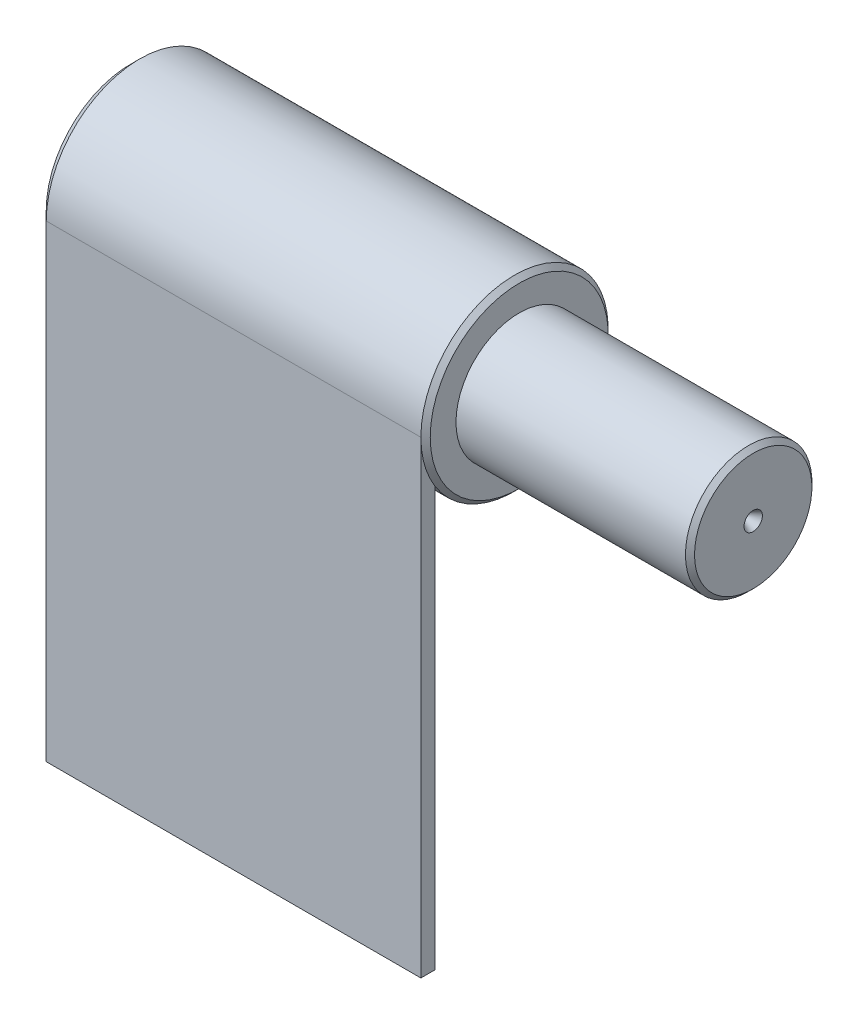
ISO-10303-21;
HEADER;
FILE_DESCRIPTION(('STEP AP214'),'2;1');
FILE_NAME('part.step','',(''),(''),'','','');
FILE_SCHEMA(('AUTOMOTIVE_DESIGN { 1 0 10303 214 1 1 1 1 }'));
ENDSEC;
DATA;
#1=APPLICATION_CONTEXT('core data for automotive mechanical design processes');
#2=APPLICATION_PROTOCOL_DEFINITION('international standard','automotive_design',2000,#1);
#3=PRODUCT_CONTEXT('',#1,'mechanical');
#4=PRODUCT('Part','Part','',(#3));
#5=PRODUCT_RELATED_PRODUCT_CATEGORY('part','',(#4));
#6=PRODUCT_DEFINITION_FORMATION('','',#4);
#7=PRODUCT_DEFINITION_CONTEXT('part definition',#1,'design');
#8=PRODUCT_DEFINITION('design','',#6,#7);
#9=PRODUCT_DEFINITION_SHAPE('','',#8);
#10=(LENGTH_UNIT() NAMED_UNIT(*) SI_UNIT(.MILLI.,.METRE.));
#11=(NAMED_UNIT(*) PLANE_ANGLE_UNIT() SI_UNIT($,.RADIAN.));
#12=(NAMED_UNIT(*) SI_UNIT($,.STERADIAN.) SOLID_ANGLE_UNIT());
#13=UNCERTAINTY_MEASURE_WITH_UNIT(LENGTH_MEASURE(1.E-05),#10,'distance_accuracy_value','');
#14=(GEOMETRIC_REPRESENTATION_CONTEXT(3) GLOBAL_UNCERTAINTY_ASSIGNED_CONTEXT((#13)) GLOBAL_UNIT_ASSIGNED_CONTEXT((#10,
#11,#12)) REPRESENTATION_CONTEXT('',''));
#15=CARTESIAN_POINT('',(0.,0.,0.));
#16=DIRECTION('',(0.,0.,1.));
#17=DIRECTION('',(1.,0.,0.));
#18=AXIS2_PLACEMENT_3D('',#15,#16,#17);
#19=CARTESIAN_POINT('',(-47.5274973026254,0.,-20.337527378994));
#20=DIRECTION('',(1.,0.,0.));
#21=DIRECTION('',(0.,0.,-1.));
#22=AXIS2_PLACEMENT_3D('',#19,#20,#21);
#23=PLANE('',#22);
#24=CARTESIAN_POINT('',(-47.5274973026254,0.,-2.337527378994));
#25=DIRECTION('',(-1.,0.,0.));
#26=DIRECTION('',(0.,0.,1.));
#27=AXIS2_PLACEMENT_3D('',#24,#25,#26);
#28=CIRCLE('',#27,18.);
#29=CARTESIAN_POINT('',(-47.5274973026254,0.,15.662472621006));
#30=VERTEX_POINT('',#29);
#31=EDGE_CURVE('E11',#30,#30,#28,.T.);
#32=ORIENTED_EDGE('',*,*,#31,.T.);
#33=EDGE_LOOP('',(#32));
#34=FACE_BOUND('',#33,.T.);
#35=ADVANCED_FACE('F35',(#34),#23,.F.);
#36=CARTESIAN_POINT('',(-45.5274973026254,0.,-2.337527378994));
#37=DIRECTION('',(1.,0.,0.));
#38=DIRECTION('',(0.,0.,-1.));
#39=AXIS2_PLACEMENT_3D('',#36,#37,#38);
#40=CONICAL_SURFACE('',#39,20.,0.78539816339745);
#41=ORIENTED_EDGE('',*,*,#31,.F.);
#42=EDGE_LOOP('',(#41));
#43=FACE_BOUND('',#42,.T.);
#44=CARTESIAN_POINT('',(-45.5274973026254,0.,-2.337527378994));
#45=DIRECTION('',(-1.,0.,0.));
#46=DIRECTION('',(0.,0.,1.));
#47=AXIS2_PLACEMENT_3D('',#44,#45,#46);
#48=CIRCLE('',#47,20.);
#49=CARTESIAN_POINT('',(-45.5274973026254,0.,17.662472621006));
#50=VERTEX_POINT('',#49);
#51=CARTESIAN_POINT('',(-45.5274973026254,-10.5357384574783,14.6624201255018));
#52=VERTEX_POINT('',#51);
#53=EDGE_CURVE('E42',#50,#52,#48,.T.);
#54=ORIENTED_EDGE('',*,*,#53,.T.);
#55=EDGE_CURVE('E55',#52,#50,#48,.T.);
#56=ORIENTED_EDGE('',*,*,#55,.T.);
#57=EDGE_LOOP('',(#54,#56));
#58=FACE_BOUND('',#57,.T.);
#59=ADVANCED_FACE('F133',(#43,#58),#40,.T.);
#60=CARTESIAN_POINT('',(-58.6080417490214,0.,-2.337527378994));
#61=DIRECTION('',(-1.,0.,0.));
#62=DIRECTION('',(0.,0.,1.));
#63=AXIS2_PLACEMENT_3D('',#60,#61,#62);
#64=CYLINDRICAL_SURFACE('',#63,20.);
#65=CARTESIAN_POINT('',(34.4725026973746,0.,-2.337527378994));
#66=DIRECTION('',(-1.,0.,0.));
#67=DIRECTION('',(0.,0.,1.));
#68=AXIS2_PLACEMENT_3D('',#65,#66,#67);
#69=CIRCLE('',#68,20.);
#70=CARTESIAN_POINT('',(34.4725026973746,0.,17.662472621006));
#71=VERTEX_POINT('',#70);
#72=CARTESIAN_POINT('',(34.4725026973746,-10.5357384574783,14.6624201255018));
#73=VERTEX_POINT('',#72);
#74=EDGE_CURVE('E132',#71,#73,#69,.T.);
#75=ORIENTED_EDGE('',*,*,#74,.T.);
#76=DIRECTION('',(-1.,0.,0.));
#77=VECTOR('',#76,1.);
#78=CARTESIAN_POINT('',(-58.6080417490214,-10.5357384574783,14.6624201255018));
#79=LINE('',#78,#77);
#80=EDGE_CURVE('E49',#73,#52,#79,.T.);
#81=ORIENTED_EDGE('',*,*,#80,.T.);
#82=ORIENTED_EDGE('',*,*,#53,.F.);
#83=DIRECTION('',(1.,0.,0.));
#84=VECTOR('',#83,1.);
#85=CARTESIAN_POINT('',(-45.5274973026254,0.,17.662472621006));
#86=LINE('',#85,#84);
#87=EDGE_CURVE('E86',#50,#71,#86,.T.);
#88=ORIENTED_EDGE('',*,*,#87,.T.);
#89=EDGE_LOOP('',(#75,#81,#82,#88));
#90=FACE_BOUND('',#89,.T.);
#91=ADVANCED_FACE('F142',(#90),#64,.T.);
#92=CARTESIAN_POINT('',(35.4725026973746,0.,-2.337527378994));
#93=DIRECTION('',(-1.,0.,0.));
#94=DIRECTION('',(0.,0.,1.));
#95=AXIS2_PLACEMENT_3D('',#92,#93,#94);
#96=CONICAL_SURFACE('',#95,19.,0.785398163397448);
#97=ORIENTED_EDGE('',*,*,#74,.F.);
#98=EDGE_CURVE('E131',#73,#71,#69,.T.);
#99=ORIENTED_EDGE('',*,*,#98,.F.);
#100=EDGE_LOOP('',(#97,#99));
#101=FACE_BOUND('',#100,.T.);
#102=CARTESIAN_POINT('',(35.4725026973746,0.,-2.337527378994));
#103=DIRECTION('',(-1.,0.,0.));
#104=DIRECTION('',(0.,0.,1.));
#105=AXIS2_PLACEMENT_3D('',#102,#103,#104);
#106=CIRCLE('',#105,19.);
#107=CARTESIAN_POINT('',(35.4725026973746,0.,16.662472621006));
#108=VERTEX_POINT('',#107);
#109=EDGE_CURVE('E128',#108,#108,#106,.T.);
#110=ORIENTED_EDGE('',*,*,#109,.T.);
#111=EDGE_LOOP('',(#110));
#112=FACE_BOUND('',#111,.T.);
#113=ADVANCED_FACE('F140',(#101,#112),#96,.T.);
#114=CARTESIAN_POINT('',(35.4725026973746,0.,-21.337527378994));
#115=DIRECTION('',(-1.,0.,0.));
#116=DIRECTION('',(0.,0.,1.));
#117=AXIS2_PLACEMENT_3D('',#114,#115,#116);
#118=PLANE('',#117);
#119=ORIENTED_EDGE('',*,*,#109,.F.);
#120=EDGE_LOOP('',(#119));
#121=FACE_BOUND('',#120,.T.);
#122=CARTESIAN_POINT('',(35.4725026973746,0.,-2.337527378994));
#123=DIRECTION('',(-1.,0.,0.));
#124=DIRECTION('',(0.,0.,1.));
#125=AXIS2_PLACEMENT_3D('',#122,#123,#124);
#126=CIRCLE('',#125,13.5);
#127=CARTESIAN_POINT('',(35.4725026973746,0.,11.162472621006));
#128=VERTEX_POINT('',#127);
#129=EDGE_CURVE('E125',#128,#128,#126,.T.);
#130=ORIENTED_EDGE('',*,*,#129,.T.);
#131=EDGE_LOOP('',(#130));
#132=FACE_BOUND('',#131,.T.);
#133=ADVANCED_FACE('F149',(#121,#132),#118,.F.);
#134=CARTESIAN_POINT('',(-58.6080417490214,0.,-2.337527378994));
#135=DIRECTION('',(-1.,0.,0.));
#136=DIRECTION('',(0.,0.,1.));
#137=AXIS2_PLACEMENT_3D('',#134,#135,#136);
#138=CYLINDRICAL_SURFACE('',#137,13.5);
#139=ORIENTED_EDGE('',*,*,#129,.F.);
#140=EDGE_LOOP('',(#139));
#141=FACE_BOUND('',#140,.T.);
#142=CARTESIAN_POINT('',(84.4725026973746,0.,-2.337527378994));
#143=DIRECTION('',(-1.,0.,0.));
#144=DIRECTION('',(0.,0.,1.));
#145=AXIS2_PLACEMENT_3D('',#142,#143,#144);
#146=CIRCLE('',#145,13.5);
#147=CARTESIAN_POINT('',(84.4725026973746,0.,11.162472621006));
#148=VERTEX_POINT('',#147);
#149=EDGE_CURVE('E122',#148,#148,#146,.T.);
#150=ORIENTED_EDGE('',*,*,#149,.T.);
#151=EDGE_LOOP('',(#150));
#152=FACE_BOUND('',#151,.T.);
#153=ADVANCED_FACE('F182',(#141,#152),#138,.T.);
#154=CARTESIAN_POINT('',(85.4415583764698,0.,-2.337527378994));
#155=DIRECTION('',(-1.,0.,0.));
#156=DIRECTION('',(0.,0.,1.));
#157=AXIS2_PLACEMENT_3D('',#154,#155,#156);
#158=CONICAL_SURFACE('',#157,12.5309443209048,0.785398163397463);
#159=ORIENTED_EDGE('',*,*,#149,.F.);
#160=EDGE_LOOP('',(#159));
#161=FACE_BOUND('',#160,.T.);
#162=CARTESIAN_POINT('',(85.4415583764698,0.,-2.337527378994));
#163=DIRECTION('',(-1.,0.,0.));
#164=DIRECTION('',(0.,0.,1.));
#165=AXIS2_PLACEMENT_3D('',#162,#163,#164);
#166=CIRCLE('',#165,12.5309443209048);
#167=CARTESIAN_POINT('',(85.4415583764698,0.,10.1934169419108));
#168=VERTEX_POINT('',#167);
#169=EDGE_CURVE('E119',#168,#168,#166,.T.);
#170=ORIENTED_EDGE('',*,*,#169,.T.);
#171=EDGE_LOOP('',(#170));
#172=FACE_BOUND('',#171,.T.);
#173=ADVANCED_FACE('F189',(#161,#172),#158,.T.);
#174=CARTESIAN_POINT('',(85.4415583764698,0.,-14.8684716998988));
#175=DIRECTION('',(-1.,0.,0.));
#176=DIRECTION('',(0.,0.,1.));
#177=AXIS2_PLACEMENT_3D('',#174,#175,#176);
#178=PLANE('',#177);
#179=ORIENTED_EDGE('',*,*,#169,.F.);
#180=EDGE_LOOP('',(#179));
#181=FACE_BOUND('',#180,.T.);
#182=CARTESIAN_POINT('',(85.4415583764698,0.,-2.337527378994));
#183=DIRECTION('',(-1.,0.,0.));
#184=DIRECTION('',(0.,0.,1.));
#185=AXIS2_PLACEMENT_3D('',#182,#183,#184);
#186=CIRCLE('',#185,1.95889593673989);
#187=CARTESIAN_POINT('',(85.4415583764698,0.,-0.378631442254107));
#188=VERTEX_POINT('',#187);
#189=EDGE_CURVE('E116',#188,#188,#186,.T.);
#190=ORIENTED_EDGE('',*,*,#189,.T.);
#191=EDGE_LOOP('',(#190));
#192=FACE_BOUND('',#191,.T.);
#193=ADVANCED_FACE('F197',(#181,#192),#178,.F.);
#194=CARTESIAN_POINT('',(82.259183131536,0.,-2.337527378994));
#195=DIRECTION('',(1.,0.,0.));
#196=DIRECTION('',(0.,0.,-1.));
#197=AXIS2_PLACEMENT_3D('',#194,#195,#196);
#198=CONICAL_SURFACE('',#197,0.,0.551771479369417);
#199=ORIENTED_EDGE('',*,*,#189,.F.);
#200=EDGE_LOOP('',(#199));
#201=FACE_BOUND('',#200,.T.);
#202=CARTESIAN_POINT('',(82.259183131536,0.,-2.337527378994));
#203=VERTEX_POINT('',#202);
#204=VERTEX_LOOP('',#203);
#205=FACE_BOUND('',#204,.T.);
#206=ADVANCED_FACE('F205',(#201,#205),#198,.F.);
#207=CARTESIAN_POINT('',(-45.5274973026254,-100.,17.662472621006));
#208=DIRECTION('',(-1.,0.,0.));
#209=DIRECTION('',(0.,0.,1.));
#210=AXIS2_PLACEMENT_3D('',#207,#208,#209);
#211=PLANE('',#210);
#212=ORIENTED_EDGE('',*,*,#55,.F.);
#213=DIRECTION('',(0.,1.,0.));
#214=VECTOR('',#213,1.);
#215=CARTESIAN_POINT('',(-45.5274973026254,-100.,14.6624201255018));
#216=LINE('',#215,#214);
#217=CARTESIAN_POINT('',(-45.5274973026254,-100.,14.6624201255018));
#218=VERTEX_POINT('',#217);
#219=EDGE_CURVE('E104',#218,#52,#216,.T.);
#220=ORIENTED_EDGE('',*,*,#219,.F.);
#221=DIRECTION('',(0.,0.,1.));
#222=VECTOR('',#221,1.);
#223=CARTESIAN_POINT('',(-45.5274973026254,-100.,17.662472621006));
#224=LINE('',#223,#222);
#225=CARTESIAN_POINT('',(-45.5274973026254,-100.,17.662472621006));
#226=VERTEX_POINT('',#225);
#227=EDGE_CURVE('E97',#218,#226,#224,.T.);
#228=ORIENTED_EDGE('',*,*,#227,.T.);
#229=DIRECTION('',(0.,1.,0.));
#230=VECTOR('',#229,1.);
#231=CARTESIAN_POINT('',(-45.5274973026254,-100.,17.662472621006));
#232=LINE('',#231,#230);
#233=EDGE_CURVE('E80',#226,#50,#232,.T.);
#234=ORIENTED_EDGE('',*,*,#233,.T.);
#235=EDGE_LOOP('',(#212,#220,#228,#234));
#236=FACE_BOUND('',#235,.T.);
#237=ADVANCED_FACE('F102',(#236),#211,.T.);
#238=CARTESIAN_POINT('',(-45.5274973026254,-100.,14.6624201255018));
#239=DIRECTION('',(0.,0.,-1.));
#240=DIRECTION('',(-1.,0.,0.));
#241=AXIS2_PLACEMENT_3D('',#238,#239,#240);
#242=PLANE('',#241);
#243=ORIENTED_EDGE('',*,*,#80,.F.);
#244=DIRECTION('',(0.,1.,0.));
#245=VECTOR('',#244,1.);
#246=CARTESIAN_POINT('',(34.4725026973746,-100.,14.6624201255018));
#247=LINE('',#246,#245);
#248=CARTESIAN_POINT('',(34.4725026973746,-100.,14.6624201255018));
#249=VERTEX_POINT('',#248);
#250=EDGE_CURVE('E111',#249,#73,#247,.T.);
#251=ORIENTED_EDGE('',*,*,#250,.F.);
#252=DIRECTION('',(-1.,0.,0.));
#253=VECTOR('',#252,1.);
#254=CARTESIAN_POINT('',(-45.5274973026254,-100.,14.6624201255018));
#255=LINE('',#254,#253);
#256=EDGE_CURVE('E90',#249,#218,#255,.T.);
#257=ORIENTED_EDGE('',*,*,#256,.T.);
#258=ORIENTED_EDGE('',*,*,#219,.T.);
#259=EDGE_LOOP('',(#243,#251,#257,#258));
#260=FACE_BOUND('',#259,.T.);
#261=ADVANCED_FACE('F135',(#260),#242,.T.);
#262=CARTESIAN_POINT('',(34.4725026973746,-100.,17.662472621006));
#263=DIRECTION('',(1.,0.,0.));
#264=DIRECTION('',(0.,0.,-1.));
#265=AXIS2_PLACEMENT_3D('',#262,#263,#264);
#266=PLANE('',#265);
#267=ORIENTED_EDGE('',*,*,#98,.T.);
#268=DIRECTION('',(0.,1.,0.));
#269=VECTOR('',#268,1.);
#270=CARTESIAN_POINT('',(34.4725026973746,-100.,17.662472621006));
#271=LINE('',#270,#269);
#272=CARTESIAN_POINT('',(34.4725026973746,-100.,17.662472621006));
#273=VERTEX_POINT('',#272);
#274=EDGE_CURVE('E89',#273,#71,#271,.T.);
#275=ORIENTED_EDGE('',*,*,#274,.F.);
#276=DIRECTION('',(0.,0.,-1.));
#277=VECTOR('',#276,1.);
#278=CARTESIAN_POINT('',(34.4725026973746,-100.,17.662472621006));
#279=LINE('',#278,#277);
#280=EDGE_CURVE('E100',#273,#249,#279,.T.);
#281=ORIENTED_EDGE('',*,*,#280,.T.);
#282=ORIENTED_EDGE('',*,*,#250,.T.);
#283=EDGE_LOOP('',(#267,#275,#281,#282));
#284=FACE_BOUND('',#283,.T.);
#285=ADVANCED_FACE('F138',(#284),#266,.T.);
#286=CARTESIAN_POINT('',(-45.5274973026254,-100.,17.662472621006));
#287=DIRECTION('',(0.,0.,1.));
#288=DIRECTION('',(1.,0.,0.));
#289=AXIS2_PLACEMENT_3D('',#286,#287,#288);
#290=PLANE('',#289);
#291=ORIENTED_EDGE('',*,*,#87,.F.);
#292=ORIENTED_EDGE('',*,*,#233,.F.);
#293=DIRECTION('',(1.,0.,0.));
#294=VECTOR('',#293,1.);
#295=CARTESIAN_POINT('',(-45.5274973026254,-100.,17.662472621006));
#296=LINE('',#295,#294);
#297=EDGE_CURVE('E84',#226,#273,#296,.T.);
#298=ORIENTED_EDGE('',*,*,#297,.T.);
#299=ORIENTED_EDGE('',*,*,#274,.T.);
#300=EDGE_LOOP('',(#291,#292,#298,#299));
#301=FACE_BOUND('',#300,.T.);
#302=ADVANCED_FACE('F82',(#301),#290,.T.);
#303=CARTESIAN_POINT('',(0.,-100.,0.));
#304=DIRECTION('',(0.,-1.,0.));
#305=DIRECTION('',(0.,0.,-1.));
#306=AXIS2_PLACEMENT_3D('',#303,#304,#305);
#307=PLANE('',#306);
#308=ORIENTED_EDGE('',*,*,#227,.F.);
#309=ORIENTED_EDGE('',*,*,#256,.F.);
#310=ORIENTED_EDGE('',*,*,#280,.F.);
#311=ORIENTED_EDGE('',*,*,#297,.F.);
#312=EDGE_LOOP('',(#308,#309,#310,#311));
#313=FACE_BOUND('',#312,.T.);
#314=ADVANCED_FACE('F95',(#313),#307,.T.);
#315=CLOSED_SHELL('',(#35,#59,#91,#113,#133,#153,#173,#193,#206,#237,#261,#285,#302,#314));
#316=MANIFOLD_SOLID_BREP('B2',#315);
#317=ADVANCED_BREP_SHAPE_REPRESENTATION('',(#18,#316),#14);
#318=SHAPE_DEFINITION_REPRESENTATION(#9,#317);
ENDSEC;
END-ISO-10303-21;
